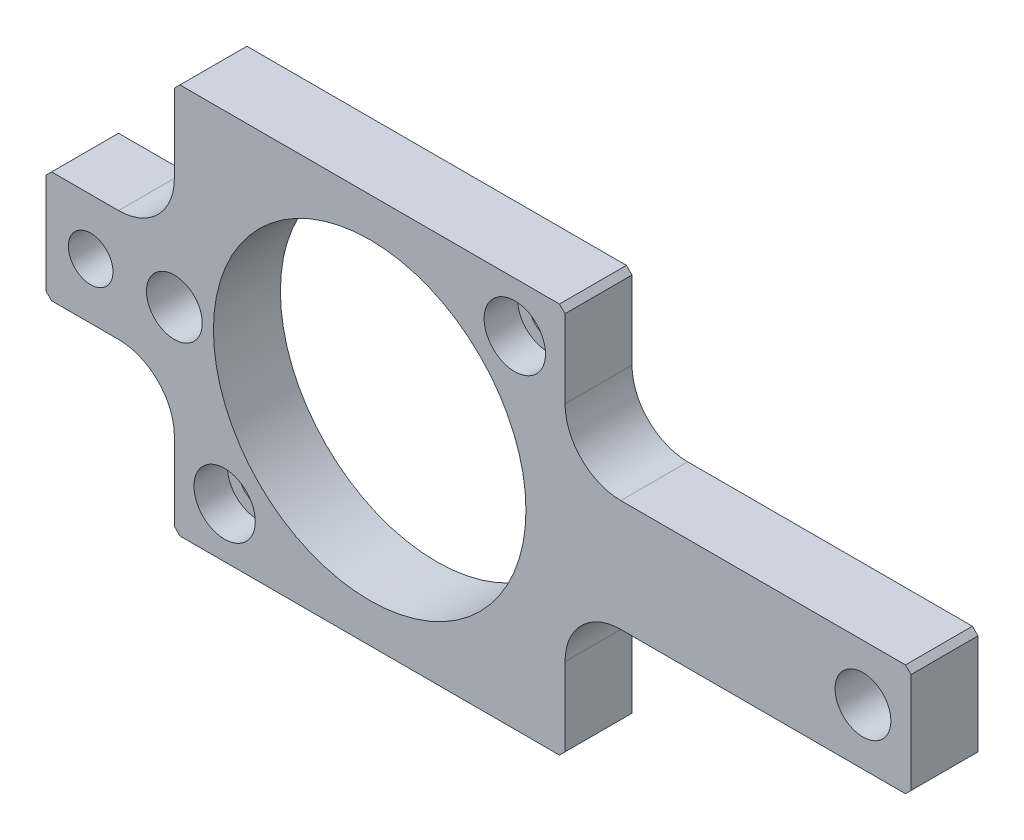
ISO-10303-21;
HEADER;
FILE_DESCRIPTION(('STEP AP214'),'2;1');
FILE_NAME('part.step','',(''),(''),'','','');
FILE_SCHEMA(('AUTOMOTIVE_DESIGN { 1 0 10303 214 1 1 1 1 }'));
ENDSEC;
DATA;
#1=APPLICATION_CONTEXT('core data for automotive mechanical design processes');
#2=APPLICATION_PROTOCOL_DEFINITION('international standard','automotive_design',2000,#1);
#3=PRODUCT_CONTEXT('',#1,'mechanical');
#4=PRODUCT('Part','Part','',(#3));
#5=PRODUCT_RELATED_PRODUCT_CATEGORY('part','',(#4));
#6=PRODUCT_DEFINITION_FORMATION('','',#4);
#7=PRODUCT_DEFINITION_CONTEXT('part definition',#1,'design');
#8=PRODUCT_DEFINITION('design','',#6,#7);
#9=PRODUCT_DEFINITION_SHAPE('','',#8);
#10=(LENGTH_UNIT() NAMED_UNIT(*) SI_UNIT(.MILLI.,.METRE.));
#11=(NAMED_UNIT(*) PLANE_ANGLE_UNIT() SI_UNIT($,.RADIAN.));
#12=(NAMED_UNIT(*) SI_UNIT($,.STERADIAN.) SOLID_ANGLE_UNIT());
#13=UNCERTAINTY_MEASURE_WITH_UNIT(LENGTH_MEASURE(1.E-05),#10,'distance_accuracy_value','');
#14=(GEOMETRIC_REPRESENTATION_CONTEXT(3) GLOBAL_UNCERTAINTY_ASSIGNED_CONTEXT((#13)) GLOBAL_UNIT_ASSIGNED_CONTEXT((#10,
#11,#12)) REPRESENTATION_CONTEXT('',''));
#15=CARTESIAN_POINT('',(0.,0.,0.));
#16=DIRECTION('',(0.,0.,1.));
#17=DIRECTION('',(1.,0.,0.));
#18=AXIS2_PLACEMENT_3D('',#15,#16,#17);
#19=CARTESIAN_POINT('',(80.,15.,12.));
#20=DIRECTION('',(0.,0.,-1.));
#21=DIRECTION('',(-1.,0.,0.));
#22=AXIS2_PLACEMENT_3D('',#19,#20,#21);
#23=PLANE('',#22);
#24=CARTESIAN_POINT('',(123.39,35.,12.));
#25=DIRECTION('',(0.,0.,1.));
#26=DIRECTION('',(1.,0.,0.));
#27=AXIS2_PLACEMENT_3D('',#24,#25,#26);
#28=CIRCLE('',#27,4.99999999999999);
#29=CARTESIAN_POINT('',(128.39,35.,12.));
#30=VERTEX_POINT('',#29);
#31=EDGE_CURVE('E515',#30,#30,#28,.T.);
#32=ORIENTED_EDGE('',*,*,#31,.F.);
#33=EDGE_LOOP('',(#32));
#34=FACE_BOUND('',#33,.T.);
#35=CARTESIAN_POINT('',(-15.,35.,12.));
#36=DIRECTION('',(0.,0.,1.));
#37=DIRECTION('',(1.,0.,0.));
#38=AXIS2_PLACEMENT_3D('',#35,#36,#37);
#39=CIRCLE('',#38,4.);
#40=CARTESIAN_POINT('',(-11.,35.,12.));
#41=VERTEX_POINT('',#40);
#42=EDGE_CURVE('E509',#41,#41,#39,.T.);
#43=ORIENTED_EDGE('',*,*,#42,.F.);
#44=EDGE_LOOP('',(#43));
#45=FACE_BOUND('',#44,.T.);
#46=CARTESIAN_POINT('',(0.,35.,12.));
#47=DIRECTION('',(0.,0.,1.));
#48=DIRECTION('',(1.,0.,0.));
#49=AXIS2_PLACEMENT_3D('',#46,#47,#48);
#50=CIRCLE('',#49,5.);
#51=CARTESIAN_POINT('',(5.,35.,12.));
#52=VERTEX_POINT('',#51);
#53=EDGE_CURVE('E503',#52,#52,#50,.T.);
#54=ORIENTED_EDGE('',*,*,#53,.F.);
#55=EDGE_LOOP('',(#54));
#56=FACE_BOUND('',#55,.T.);
#57=CARTESIAN_POINT('',(9.00000000000001,9.00000000000001,12.));
#58=DIRECTION('',(0.,0.,1.));
#59=DIRECTION('',(1.,0.,0.));
#60=AXIS2_PLACEMENT_3D('',#57,#58,#59);
#61=CIRCLE('',#60,5.5);
#62=CARTESIAN_POINT('',(14.5,9.00000000000001,12.));
#63=VERTEX_POINT('',#62);
#64=EDGE_CURVE('E497',#63,#63,#61,.T.);
#65=ORIENTED_EDGE('',*,*,#64,.F.);
#66=EDGE_LOOP('',(#65));
#67=FACE_BOUND('',#66,.T.);
#68=CARTESIAN_POINT('',(61.,61.,12.));
#69=DIRECTION('',(0.,0.,1.));
#70=DIRECTION('',(1.,0.,0.));
#71=AXIS2_PLACEMENT_3D('',#68,#69,#70);
#72=CIRCLE('',#71,5.5);
#73=CARTESIAN_POINT('',(66.5,61.,12.));
#74=VERTEX_POINT('',#73);
#75=EDGE_CURVE('E485',#74,#74,#72,.T.);
#76=ORIENTED_EDGE('',*,*,#75,.F.);
#77=EDGE_LOOP('',(#76));
#78=FACE_BOUND('',#77,.T.);
#79=DIRECTION('',(0.,-1.,0.));
#80=VECTOR('',#79,1.);
#81=CARTESIAN_POINT('',(0.,14.9999999999999,12.));
#82=LINE('',#81,#80);
#83=CARTESIAN_POINT('',(0.,14.9999999999999,12.));
#84=VERTEX_POINT('',#83);
#85=CARTESIAN_POINT('',(0.,1.00000000000002,12.));
#86=VERTEX_POINT('',#85);
#87=EDGE_CURVE('E252',#84,#86,#82,.T.);
#88=ORIENTED_EDGE('',*,*,#87,.T.);
#89=DIRECTION('',(-0.707106781186544,0.707106781186552,0.));
#90=VECTOR('',#89,1.);
#91=CARTESIAN_POINT('',(1.00000000000001,0.,12.));
#92=LINE('',#91,#90);
#93=CARTESIAN_POINT('',(1.00000000000001,0.,12.));
#94=VERTEX_POINT('',#93);
#95=EDGE_CURVE('E344',#86,#94,#92,.F.);
#96=ORIENTED_EDGE('',*,*,#95,.T.);
#97=DIRECTION('',(1.,0.,0.));
#98=VECTOR('',#97,1.);
#99=CARTESIAN_POINT('',(0.,0.,12.));
#100=LINE('',#99,#98);
#101=CARTESIAN_POINT('',(69.,0.,12.));
#102=VERTEX_POINT('',#101);
#103=EDGE_CURVE('E255',#94,#102,#100,.T.);
#104=ORIENTED_EDGE('',*,*,#103,.T.);
#105=DIRECTION('',(-0.707106781186542,-0.707106781186553,0.));
#106=VECTOR('',#105,1.);
#107=CARTESIAN_POINT('',(70.,1.00000000000002,12.));
#108=LINE('',#107,#106);
#109=CARTESIAN_POINT('',(70.,1.00000000000002,12.));
#110=VERTEX_POINT('',#109);
#111=EDGE_CURVE('E331',#102,#110,#108,.F.);
#112=ORIENTED_EDGE('',*,*,#111,.T.);
#113=DIRECTION('',(0.,1.,0.));
#114=VECTOR('',#113,1.);
#115=CARTESIAN_POINT('',(70.,0.,12.));
#116=LINE('',#115,#114);
#117=CARTESIAN_POINT('',(70.,14.9999999999999,12.));
#118=VERTEX_POINT('',#117);
#119=EDGE_CURVE('E258',#110,#118,#116,.T.);
#120=ORIENTED_EDGE('',*,*,#119,.T.);
#121=CARTESIAN_POINT('',(80.,15.,12.));
#122=DIRECTION('',(0.,0.,-1.));
#123=DIRECTION('',(-1.,0.,0.));
#124=AXIS2_PLACEMENT_3D('',#121,#122,#123);
#125=CIRCLE('',#124,10.);
#126=CARTESIAN_POINT('',(80.0000000000001,25.,12.));
#127=VERTEX_POINT('',#126);
#128=EDGE_CURVE('E212',#118,#127,#125,.T.);
#129=ORIENTED_EDGE('',*,*,#128,.T.);
#130=DIRECTION('',(1.,0.,0.));
#131=VECTOR('',#130,1.);
#132=CARTESIAN_POINT('',(80.0000000000001,25.,12.));
#133=LINE('',#132,#131);
#134=CARTESIAN_POINT('',(131.,25.,12.));
#135=VERTEX_POINT('',#134);
#136=EDGE_CURVE('E261',#127,#135,#133,.T.);
#137=ORIENTED_EDGE('',*,*,#136,.T.);
#138=DIRECTION('',(-0.707106781186541,-0.707106781186554,0.));
#139=VECTOR('',#138,1.);
#140=CARTESIAN_POINT('',(132.,26.,12.));
#141=LINE('',#140,#139);
#142=CARTESIAN_POINT('',(132.,26.,12.));
#143=VERTEX_POINT('',#142);
#144=EDGE_CURVE('E333',#135,#143,#141,.F.);
#145=ORIENTED_EDGE('',*,*,#144,.T.);
#146=DIRECTION('',(0.,1.,0.));
#147=VECTOR('',#146,1.);
#148=CARTESIAN_POINT('',(132.,25.,12.));
#149=LINE('',#148,#147);
#150=CARTESIAN_POINT('',(132.,44.,12.));
#151=VERTEX_POINT('',#150);
#152=EDGE_CURVE('E264',#143,#151,#149,.T.);
#153=ORIENTED_EDGE('',*,*,#152,.T.);
#154=DIRECTION('',(0.707106781186555,-0.70710678118654,0.));
#155=VECTOR('',#154,1.);
#156=CARTESIAN_POINT('',(131.,45.,12.));
#157=LINE('',#156,#155);
#158=CARTESIAN_POINT('',(131.,45.,12.));
#159=VERTEX_POINT('',#158);
#160=EDGE_CURVE('E335',#151,#159,#157,.F.);
#161=ORIENTED_EDGE('',*,*,#160,.T.);
#162=DIRECTION('',(-1.,0.,0.));
#163=VECTOR('',#162,1.);
#164=CARTESIAN_POINT('',(132.,45.,12.));
#165=LINE('',#164,#163);
#166=CARTESIAN_POINT('',(80.0000000000001,45.,12.));
#167=VERTEX_POINT('',#166);
#168=EDGE_CURVE('E267',#159,#167,#165,.T.);
#169=ORIENTED_EDGE('',*,*,#168,.T.);
#170=CARTESIAN_POINT('',(80.,55.,12.));
#171=DIRECTION('',(0.,0.,-1.));
#172=DIRECTION('',(1.,0.,0.));
#173=AXIS2_PLACEMENT_3D('',#170,#171,#172);
#174=CIRCLE('',#173,10.);
#175=CARTESIAN_POINT('',(70.,55.0000000000001,12.));
#176=VERTEX_POINT('',#175);
#177=EDGE_CURVE('E269',#167,#176,#174,.T.);
#178=ORIENTED_EDGE('',*,*,#177,.T.);
#179=DIRECTION('',(0.,1.,0.));
#180=VECTOR('',#179,1.);
#181=CARTESIAN_POINT('',(70.,55.0000000000001,12.));
#182=LINE('',#181,#180);
#183=CARTESIAN_POINT('',(70.,69.,12.));
#184=VERTEX_POINT('',#183);
#185=EDGE_CURVE('E271',#176,#184,#182,.T.);
#186=ORIENTED_EDGE('',*,*,#185,.T.);
#187=DIRECTION('',(0.707106781186552,-0.707106781186543,0.));
#188=VECTOR('',#187,1.);
#189=CARTESIAN_POINT('',(69.,70.,12.));
#190=LINE('',#189,#188);
#191=CARTESIAN_POINT('',(69.,70.,12.));
#192=VERTEX_POINT('',#191);
#193=EDGE_CURVE('E337',#184,#192,#190,.F.);
#194=ORIENTED_EDGE('',*,*,#193,.T.);
#195=DIRECTION('',(-1.,0.,0.));
#196=VECTOR('',#195,1.);
#197=CARTESIAN_POINT('',(70.,70.,12.));
#198=LINE('',#197,#196);
#199=CARTESIAN_POINT('',(1.,70.,12.));
#200=VERTEX_POINT('',#199);
#201=EDGE_CURVE('E274',#192,#200,#198,.T.);
#202=ORIENTED_EDGE('',*,*,#201,.T.);
#203=DIRECTION('',(0.707106781186546,0.707106781186549,0.));
#204=VECTOR('',#203,1.);
#205=CARTESIAN_POINT('',(0.,69.,12.));
#206=LINE('',#205,#204);
#207=CARTESIAN_POINT('',(0.,69.,12.));
#208=VERTEX_POINT('',#207);
#209=EDGE_CURVE('E339',#200,#208,#206,.F.);
#210=ORIENTED_EDGE('',*,*,#209,.T.);
#211=DIRECTION('',(0.,-1.,0.));
#212=VECTOR('',#211,1.);
#213=CARTESIAN_POINT('',(0.,70.,12.));
#214=LINE('',#213,#212);
#215=CARTESIAN_POINT('',(0.,55.0000000000001,12.));
#216=VERTEX_POINT('',#215);
#217=EDGE_CURVE('E277',#208,#216,#214,.T.);
#218=ORIENTED_EDGE('',*,*,#217,.T.);
#219=CARTESIAN_POINT('',(-10.,55.,12.));
#220=DIRECTION('',(0.,0.,-1.));
#221=DIRECTION('',(-1.,0.,0.));
#222=AXIS2_PLACEMENT_3D('',#219,#220,#221);
#223=CIRCLE('',#222,10.);
#224=CARTESIAN_POINT('',(-10.0000000000001,45.,12.));
#225=VERTEX_POINT('',#224);
#226=EDGE_CURVE('E279',#216,#225,#223,.T.);
#227=ORIENTED_EDGE('',*,*,#226,.T.);
#228=DIRECTION('',(-1.,0.,0.));
#229=VECTOR('',#228,1.);
#230=CARTESIAN_POINT('',(-10.0000000000001,45.,12.));
#231=LINE('',#230,#229);
#232=CARTESIAN_POINT('',(-22.,45.,12.));
#233=VERTEX_POINT('',#232);
#234=EDGE_CURVE('E281',#225,#233,#231,.T.);
#235=ORIENTED_EDGE('',*,*,#234,.T.);
#236=DIRECTION('',(0.707106781186545,0.70710678118655,0.));
#237=VECTOR('',#236,1.);
#238=CARTESIAN_POINT('',(-23.,44.,12.));
#239=LINE('',#238,#237);
#240=CARTESIAN_POINT('',(-23.,44.,12.));
#241=VERTEX_POINT('',#240);
#242=EDGE_CURVE('E341',#233,#241,#239,.F.);
#243=ORIENTED_EDGE('',*,*,#242,.T.);
#244=DIRECTION('',(0.,-1.,0.));
#245=VECTOR('',#244,1.);
#246=CARTESIAN_POINT('',(-23.,45.,12.));
#247=LINE('',#246,#245);
#248=CARTESIAN_POINT('',(-23.,26.,12.));
#249=VERTEX_POINT('',#248);
#250=EDGE_CURVE('E284',#241,#249,#247,.T.);
#251=ORIENTED_EDGE('',*,*,#250,.T.);
#252=DIRECTION('',(-0.707106781186551,0.707106781186544,0.));
#253=VECTOR('',#252,1.);
#254=CARTESIAN_POINT('',(-22.,25.,12.));
#255=LINE('',#254,#253);
#256=CARTESIAN_POINT('',(-22.,25.,12.));
#257=VERTEX_POINT('',#256);
#258=EDGE_CURVE('E48',#249,#257,#255,.F.);
#259=ORIENTED_EDGE('',*,*,#258,.T.);
#260=DIRECTION('',(1.,0.,0.));
#261=VECTOR('',#260,1.);
#262=CARTESIAN_POINT('',(-23.,25.,12.));
#263=LINE('',#262,#261);
#264=CARTESIAN_POINT('',(-10.0000000000001,25.,12.));
#265=VERTEX_POINT('',#264);
#266=EDGE_CURVE('E286',#257,#265,#263,.T.);
#267=ORIENTED_EDGE('',*,*,#266,.T.);
#268=CARTESIAN_POINT('',(-10.,15.,12.));
#269=DIRECTION('',(0.,0.,-1.));
#270=DIRECTION('',(1.,0.,0.));
#271=AXIS2_PLACEMENT_3D('',#268,#269,#270);
#272=CIRCLE('',#271,10.);
#273=EDGE_CURVE('E288',#265,#84,#272,.T.);
#274=ORIENTED_EDGE('',*,*,#273,.T.);
#275=EDGE_LOOP('',(#88,#96,#104,#112,#120,#129,#137,#145,#153,#161,#169,#178,#186,#194,#202,
#210,#218,#227,#235,#243,#251,#259,#267,#274));
#276=FACE_BOUND('',#275,.T.);
#277=CARTESIAN_POINT('',(35.,35.,12.));
#278=DIRECTION('',(0.,0.,1.));
#279=DIRECTION('',(1.,0.,0.));
#280=AXIS2_PLACEMENT_3D('',#277,#278,#279);
#281=CIRCLE('',#280,28.);
#282=CARTESIAN_POINT('',(63.,35.,12.));
#283=VERTEX_POINT('',#282);
#284=EDGE_CURVE('E468',#283,#283,#281,.T.);
#285=ORIENTED_EDGE('',*,*,#284,.F.);
#286=EDGE_LOOP('',(#285));
#287=FACE_BOUND('',#286,.T.);
#288=ADVANCED_FACE('F33',(#34,#45,#56,#67,#78,#276,#287),#23,.F.);
#289=CARTESIAN_POINT('',(80.,15.,0.));
#290=DIRECTION('',(0.,0.,-1.));
#291=DIRECTION('',(-1.,0.,0.));
#292=AXIS2_PLACEMENT_3D('',#289,#290,#291);
#293=PLANE('',#292);
#294=CARTESIAN_POINT('',(123.39,35.,-4.49293380277993E-13));
#295=DIRECTION('',(0.,0.,1.));
#296=DIRECTION('',(1.,0.,0.));
#297=AXIS2_PLACEMENT_3D('',#294,#295,#296);
#298=CIRCLE('',#297,4.99999999999999);
#299=CARTESIAN_POINT('',(128.39,35.,-4.49293380277993E-13));
#300=VERTEX_POINT('',#299);
#301=EDGE_CURVE('E512',#300,#300,#298,.T.);
#302=ORIENTED_EDGE('',*,*,#301,.T.);
#303=EDGE_LOOP('',(#302));
#304=FACE_BOUND('',#303,.T.);
#305=CARTESIAN_POINT('',(-15.,35.,-4.49293380277993E-13));
#306=DIRECTION('',(0.,0.,1.));
#307=DIRECTION('',(1.,0.,0.));
#308=AXIS2_PLACEMENT_3D('',#305,#306,#307);
#309=CIRCLE('',#308,4.);
#310=CARTESIAN_POINT('',(-11.,35.,-4.49293380277993E-13));
#311=VERTEX_POINT('',#310);
#312=EDGE_CURVE('E506',#311,#311,#309,.T.);
#313=ORIENTED_EDGE('',*,*,#312,.T.);
#314=EDGE_LOOP('',(#313));
#315=FACE_BOUND('',#314,.T.);
#316=CARTESIAN_POINT('',(0.,35.,-4.49293380277993E-13));
#317=DIRECTION('',(0.,0.,1.));
#318=DIRECTION('',(1.,0.,0.));
#319=AXIS2_PLACEMENT_3D('',#316,#317,#318);
#320=CIRCLE('',#319,5.);
#321=CARTESIAN_POINT('',(5.,35.,-4.49293380277993E-13));
#322=VERTEX_POINT('',#321);
#323=EDGE_CURVE('E500',#322,#322,#320,.T.);
#324=ORIENTED_EDGE('',*,*,#323,.T.);
#325=EDGE_LOOP('',(#324));
#326=FACE_BOUND('',#325,.T.);
#327=CARTESIAN_POINT('',(9.00000000000001,9.00000000000001,-4.49293380277993E-13));
#328=DIRECTION('',(0.,0.,1.));
#329=DIRECTION('',(1.,0.,0.));
#330=AXIS2_PLACEMENT_3D('',#327,#328,#329);
#331=CIRCLE('',#330,3.3);
#332=CARTESIAN_POINT('',(12.3,9.00000000000001,-4.49293380277993E-13));
#333=VERTEX_POINT('',#332);
#334=EDGE_CURVE('E488',#333,#333,#331,.T.);
#335=ORIENTED_EDGE('',*,*,#334,.T.);
#336=EDGE_LOOP('',(#335));
#337=FACE_BOUND('',#336,.T.);
#338=CARTESIAN_POINT('',(61.,61.,-4.49293380277993E-13));
#339=DIRECTION('',(0.,0.,1.));
#340=DIRECTION('',(1.,0.,0.));
#341=AXIS2_PLACEMENT_3D('',#338,#339,#340);
#342=CIRCLE('',#341,3.3);
#343=CARTESIAN_POINT('',(64.3,61.,-4.49293380277993E-13));
#344=VERTEX_POINT('',#343);
#345=EDGE_CURVE('E476',#344,#344,#342,.T.);
#346=ORIENTED_EDGE('',*,*,#345,.T.);
#347=EDGE_LOOP('',(#346));
#348=FACE_BOUND('',#347,.T.);
#349=DIRECTION('',(1.,0.,0.));
#350=VECTOR('',#349,1.);
#351=CARTESIAN_POINT('',(0.,0.,0.));
#352=LINE('',#351,#350);
#353=CARTESIAN_POINT('',(0.999999999999988,0.,0.));
#354=VERTEX_POINT('',#353);
#355=CARTESIAN_POINT('',(69.,0.,0.));
#356=VERTEX_POINT('',#355);
#357=EDGE_CURVE('E206',#354,#356,#352,.T.);
#358=ORIENTED_EDGE('',*,*,#357,.F.);
#359=DIRECTION('',(0.707106781186544,-0.707106781186552,0.));
#360=VECTOR('',#359,1.);
#361=CARTESIAN_POINT('',(32.9999999999996,-31.9999999999999,0.));
#362=LINE('',#361,#360);
#363=CARTESIAN_POINT('',(0.,1.00000000000002,0.));
#364=VERTEX_POINT('',#363);
#365=EDGE_CURVE('E327',#354,#364,#362,.F.);
#366=ORIENTED_EDGE('',*,*,#365,.T.);
#367=DIRECTION('',(0.,-1.,0.));
#368=VECTOR('',#367,1.);
#369=CARTESIAN_POINT('',(0.,14.9999999999999,0.));
#370=LINE('',#369,#368);
#371=CARTESIAN_POINT('',(0.,14.9999999999999,0.));
#372=VERTEX_POINT('',#371);
#373=EDGE_CURVE('E456',#372,#364,#370,.T.);
#374=ORIENTED_EDGE('',*,*,#373,.F.);
#375=CARTESIAN_POINT('',(-10.,15.,0.));
#376=DIRECTION('',(0.,0.,-1.));
#377=DIRECTION('',(1.,0.,0.));
#378=AXIS2_PLACEMENT_3D('',#375,#376,#377);
#379=CIRCLE('',#378,10.);
#380=CARTESIAN_POINT('',(-10.0000000000001,25.,0.));
#381=VERTEX_POINT('',#380);
#382=EDGE_CURVE('E250',#381,#372,#379,.T.);
#383=ORIENTED_EDGE('',*,*,#382,.F.);
#384=DIRECTION('',(1.,0.,0.));
#385=VECTOR('',#384,1.);
#386=CARTESIAN_POINT('',(-23.,25.,0.));
#387=LINE('',#386,#385);
#388=CARTESIAN_POINT('',(-22.,25.,0.));
#389=VERTEX_POINT('',#388);
#390=EDGE_CURVE('E248',#389,#381,#387,.T.);
#391=ORIENTED_EDGE('',*,*,#390,.F.);
#392=DIRECTION('',(0.707106781186551,-0.707106781186544,0.));
#393=VECTOR('',#392,1.);
#394=CARTESIAN_POINT('',(34.0000000000005,-30.9999999999999,0.));
#395=LINE('',#394,#393);
#396=CARTESIAN_POINT('',(-23.,26.,0.));
#397=VERTEX_POINT('',#396);
#398=EDGE_CURVE('E325',#389,#397,#395,.F.);
#399=ORIENTED_EDGE('',*,*,#398,.T.);
#400=DIRECTION('',(0.,-1.,0.));
#401=VECTOR('',#400,1.);
#402=CARTESIAN_POINT('',(-23.,45.,0.));
#403=LINE('',#402,#401);
#404=CARTESIAN_POINT('',(-23.,44.,0.));
#405=VERTEX_POINT('',#404);
#406=EDGE_CURVE('E246',#405,#397,#403,.T.);
#407=ORIENTED_EDGE('',*,*,#406,.F.);
#408=DIRECTION('',(-0.707106781186545,-0.70710678118655,0.));
#409=VECTOR('',#408,1.);
#410=CARTESIAN_POINT('',(13.9999999999997,80.9999999999999,0.));
#411=LINE('',#410,#409);
#412=CARTESIAN_POINT('',(-22.,45.,0.));
#413=VERTEX_POINT('',#412);
#414=EDGE_CURVE('E323',#405,#413,#411,.F.);
#415=ORIENTED_EDGE('',*,*,#414,.T.);
#416=DIRECTION('',(-1.,0.,0.));
#417=VECTOR('',#416,1.);
#418=CARTESIAN_POINT('',(-10.0000000000001,45.,0.));
#419=LINE('',#418,#417);
#420=CARTESIAN_POINT('',(-10.0000000000001,45.,0.));
#421=VERTEX_POINT('',#420);
#422=EDGE_CURVE('E243',#421,#413,#419,.T.);
#423=ORIENTED_EDGE('',*,*,#422,.F.);
#424=CARTESIAN_POINT('',(-10.,55.,0.));
#425=DIRECTION('',(0.,0.,-1.));
#426=DIRECTION('',(-1.,0.,0.));
#427=AXIS2_PLACEMENT_3D('',#424,#425,#426);
#428=CIRCLE('',#427,10.);
#429=CARTESIAN_POINT('',(0.,55.0000000000001,0.));
#430=VERTEX_POINT('',#429);
#431=EDGE_CURVE('E241',#430,#421,#428,.T.);
#432=ORIENTED_EDGE('',*,*,#431,.F.);
#433=DIRECTION('',(0.,-1.,0.));
#434=VECTOR('',#433,1.);
#435=CARTESIAN_POINT('',(0.,70.,0.));
#436=LINE('',#435,#434);
#437=CARTESIAN_POINT('',(0.,69.,0.));
#438=VERTEX_POINT('',#437);
#439=EDGE_CURVE('E239',#438,#430,#436,.T.);
#440=ORIENTED_EDGE('',*,*,#439,.F.);
#441=DIRECTION('',(-0.707106781186546,-0.707106781186549,0.));
#442=VECTOR('',#441,1.);
#443=CARTESIAN_POINT('',(12.9999999999999,81.9999999999999,0.));
#444=LINE('',#443,#442);
#445=CARTESIAN_POINT('',(1.,70.,0.));
#446=VERTEX_POINT('',#445);
#447=EDGE_CURVE('E321',#438,#446,#444,.F.);
#448=ORIENTED_EDGE('',*,*,#447,.T.);
#449=DIRECTION('',(-1.,0.,0.));
#450=VECTOR('',#449,1.);
#451=CARTESIAN_POINT('',(70.,70.,0.));
#452=LINE('',#451,#450);
#453=CARTESIAN_POINT('',(69.,70.,0.));
#454=VERTEX_POINT('',#453);
#455=EDGE_CURVE('E236',#454,#446,#452,.T.);
#456=ORIENTED_EDGE('',*,*,#455,.F.);
#457=DIRECTION('',(-0.707106781186552,0.707106781186543,0.));
#458=VECTOR('',#457,1.);
#459=CARTESIAN_POINT('',(102.,37.0000000000004,0.));
#460=LINE('',#459,#458);
#461=CARTESIAN_POINT('',(70.,69.,0.));
#462=VERTEX_POINT('',#461);
#463=EDGE_CURVE('E319',#454,#462,#460,.F.);
#464=ORIENTED_EDGE('',*,*,#463,.T.);
#465=DIRECTION('',(0.,1.,0.));
#466=VECTOR('',#465,1.);
#467=CARTESIAN_POINT('',(70.,55.0000000000001,0.));
#468=LINE('',#467,#466);
#469=CARTESIAN_POINT('',(70.,55.0000000000001,0.));
#470=VERTEX_POINT('',#469);
#471=EDGE_CURVE('E233',#470,#462,#468,.T.);
#472=ORIENTED_EDGE('',*,*,#471,.F.);
#473=CARTESIAN_POINT('',(80.,55.,0.));
#474=DIRECTION('',(0.,0.,-1.));
#475=DIRECTION('',(1.,0.,0.));
#476=AXIS2_PLACEMENT_3D('',#473,#474,#475);
#477=CIRCLE('',#476,10.);
#478=CARTESIAN_POINT('',(80.0000000000001,45.,0.));
#479=VERTEX_POINT('',#478);
#480=EDGE_CURVE('E231',#479,#470,#477,.T.);
#481=ORIENTED_EDGE('',*,*,#480,.F.);
#482=DIRECTION('',(-1.,0.,0.));
#483=VECTOR('',#482,1.);
#484=CARTESIAN_POINT('',(132.,45.,0.));
#485=LINE('',#484,#483);
#486=CARTESIAN_POINT('',(131.,45.,0.));
#487=VERTEX_POINT('',#486);
#488=EDGE_CURVE('E229',#487,#479,#485,.T.);
#489=ORIENTED_EDGE('',*,*,#488,.F.);
#490=DIRECTION('',(-0.707106781186555,0.70710678118654,0.));
#491=VECTOR('',#490,1.);
#492=CARTESIAN_POINT('',(120.499999999999,55.5000000000003,0.));
#493=LINE('',#492,#491);
#494=CARTESIAN_POINT('',(132.,44.,0.));
#495=VERTEX_POINT('',#494);
#496=EDGE_CURVE('E317',#487,#495,#493,.F.);
#497=ORIENTED_EDGE('',*,*,#496,.T.);
#498=DIRECTION('',(0.,1.,0.));
#499=VECTOR('',#498,1.);
#500=CARTESIAN_POINT('',(132.,25.,0.));
#501=LINE('',#500,#499);
#502=CARTESIAN_POINT('',(132.,26.,0.));
#503=VERTEX_POINT('',#502);
#504=EDGE_CURVE('E223',#503,#495,#501,.T.);
#505=ORIENTED_EDGE('',*,*,#504,.F.);
#506=DIRECTION('',(0.707106781186541,0.707106781186554,0.));
#507=VECTOR('',#506,1.);
#508=CARTESIAN_POINT('',(100.5,-5.50000000000008,0.));
#509=LINE('',#508,#507);
#510=CARTESIAN_POINT('',(131.,25.,0.));
#511=VERTEX_POINT('',#510);
#512=EDGE_CURVE('E315',#503,#511,#509,.F.);
#513=ORIENTED_EDGE('',*,*,#512,.T.);
#514=DIRECTION('',(1.,0.,0.));
#515=VECTOR('',#514,1.);
#516=CARTESIAN_POINT('',(80.0000000000001,25.,0.));
#517=LINE('',#516,#515);
#518=CARTESIAN_POINT('',(80.0000000000001,25.,0.));
#519=VERTEX_POINT('',#518);
#520=EDGE_CURVE('E221',#519,#511,#517,.T.);
#521=ORIENTED_EDGE('',*,*,#520,.F.);
#522=CARTESIAN_POINT('',(80.,15.,0.));
#523=DIRECTION('',(0.,0.,-1.));
#524=DIRECTION('',(-1.,0.,0.));
#525=AXIS2_PLACEMENT_3D('',#522,#523,#524);
#526=CIRCLE('',#525,10.);
#527=CARTESIAN_POINT('',(70.,14.9999999999999,0.));
#528=VERTEX_POINT('',#527);
#529=EDGE_CURVE('E205',#528,#519,#526,.T.);
#530=ORIENTED_EDGE('',*,*,#529,.F.);
#531=DIRECTION('',(0.,1.,0.));
#532=VECTOR('',#531,1.);
#533=CARTESIAN_POINT('',(70.,0.,0.));
#534=LINE('',#533,#532);
#535=CARTESIAN_POINT('',(70.,1.00000000000001,0.));
#536=VERTEX_POINT('',#535);
#537=EDGE_CURVE('E196',#536,#528,#534,.T.);
#538=ORIENTED_EDGE('',*,*,#537,.F.);
#539=DIRECTION('',(0.707106781186542,0.707106781186553,0.));
#540=VECTOR('',#539,1.);
#541=CARTESIAN_POINT('',(81.9999999999999,13.0000000000001,0.));
#542=LINE('',#541,#540);
#543=EDGE_CURVE('E313',#536,#356,#542,.F.);
#544=ORIENTED_EDGE('',*,*,#543,.T.);
#545=EDGE_LOOP('',(#358,#366,#374,#383,#391,#399,#407,#415,#423,#432,#440,#448,#456,#464,#472,
#481,#489,#497,#505,#513,#521,#530,#538,#544));
#546=FACE_BOUND('',#545,.T.);
#547=CARTESIAN_POINT('',(35.,35.,0.));
#548=DIRECTION('',(0.,0.,1.));
#549=DIRECTION('',(1.,0.,0.));
#550=AXIS2_PLACEMENT_3D('',#547,#548,#549);
#551=CIRCLE('',#550,28.);
#552=CARTESIAN_POINT('',(63.,35.,0.));
#553=VERTEX_POINT('',#552);
#554=EDGE_CURVE('E473',#553,#553,#551,.T.);
#555=ORIENTED_EDGE('',*,*,#554,.T.);
#556=EDGE_LOOP('',(#555));
#557=FACE_BOUND('',#556,.T.);
#558=ADVANCED_FACE('F218',(#304,#315,#326,#337,#348,#546,#557),#293,.T.);
#559=CARTESIAN_POINT('',(0.,14.9999999999999,12.));
#560=DIRECTION('',(1.,0.,0.));
#561=DIRECTION('',(0.,1.,0.));
#562=AXIS2_PLACEMENT_3D('',#559,#560,#561);
#563=PLANE('',#562);
#564=ORIENTED_EDGE('',*,*,#373,.T.);
#565=DIRECTION('',(0.,0.,1.));
#566=VECTOR('',#565,1.);
#567=CARTESIAN_POINT('',(0.,1.00000000000002,12.));
#568=LINE('',#567,#566);
#569=EDGE_CURVE('E329',#364,#86,#568,.T.);
#570=ORIENTED_EDGE('',*,*,#569,.T.);
#571=ORIENTED_EDGE('',*,*,#87,.F.);
#572=DIRECTION('',(0.,0.,-1.));
#573=VECTOR('',#572,1.);
#574=CARTESIAN_POINT('',(0.,14.9999999999999,12.));
#575=LINE('',#574,#573);
#576=EDGE_CURVE('E290',#84,#372,#575,.T.);
#577=ORIENTED_EDGE('',*,*,#576,.T.);
#578=EDGE_LOOP('',(#564,#570,#571,#577));
#579=FACE_BOUND('',#578,.T.);
#580=ADVANCED_FACE('F35',(#579),#563,.F.);
#581=CARTESIAN_POINT('',(0.,0.,12.));
#582=DIRECTION('',(0.,1.,0.));
#583=DIRECTION('',(0.,0.,1.));
#584=AXIS2_PLACEMENT_3D('',#581,#582,#583);
#585=PLANE('',#584);
#586=ORIENTED_EDGE('',*,*,#103,.F.);
#587=DIRECTION('',(0.,0.,-1.));
#588=VECTOR('',#587,1.);
#589=CARTESIAN_POINT('',(1.00000000000001,0.,12.));
#590=LINE('',#589,#588);
#591=EDGE_CURVE('E310',#94,#354,#590,.T.);
#592=ORIENTED_EDGE('',*,*,#591,.T.);
#593=ORIENTED_EDGE('',*,*,#357,.T.);
#594=DIRECTION('',(0.,0.,1.));
#595=VECTOR('',#594,1.);
#596=CARTESIAN_POINT('',(69.,0.,12.));
#597=LINE('',#596,#595);
#598=EDGE_CURVE('E213',#356,#102,#597,.T.);
#599=ORIENTED_EDGE('',*,*,#598,.T.);
#600=EDGE_LOOP('',(#586,#592,#593,#599));
#601=FACE_BOUND('',#600,.T.);
#602=ADVANCED_FACE('F463',(#601),#585,.F.);
#603=CARTESIAN_POINT('',(70.,0.,12.));
#604=DIRECTION('',(-1.,0.,0.));
#605=DIRECTION('',(0.,0.,1.));
#606=AXIS2_PLACEMENT_3D('',#603,#604,#605);
#607=PLANE('',#606);
#608=ORIENTED_EDGE('',*,*,#119,.F.);
#609=DIRECTION('',(0.,0.,-1.));
#610=VECTOR('',#609,1.);
#611=CARTESIAN_POINT('',(70.,1.00000000000002,12.));
#612=LINE('',#611,#610);
#613=EDGE_CURVE('E11',#110,#536,#612,.T.);
#614=ORIENTED_EDGE('',*,*,#613,.T.);
#615=ORIENTED_EDGE('',*,*,#537,.T.);
#616=DIRECTION('',(0.,0.,-1.));
#617=VECTOR('',#616,1.);
#618=CARTESIAN_POINT('',(70.,14.9999999999999,12.));
#619=LINE('',#618,#617);
#620=EDGE_CURVE('E200',#118,#528,#619,.T.);
#621=ORIENTED_EDGE('',*,*,#620,.F.);
#622=EDGE_LOOP('',(#608,#614,#615,#621));
#623=FACE_BOUND('',#622,.T.);
#624=ADVANCED_FACE('F199',(#623),#607,.F.);
#625=CARTESIAN_POINT('',(80.,15.,12.));
#626=DIRECTION('',(0.,0.,-1.));
#627=DIRECTION('',(-1.,0.,0.));
#628=AXIS2_PLACEMENT_3D('',#625,#626,#627);
#629=CYLINDRICAL_SURFACE('',#628,10.);
#630=ORIENTED_EDGE('',*,*,#529,.T.);
#631=DIRECTION('',(0.,0.,-1.));
#632=VECTOR('',#631,1.);
#633=CARTESIAN_POINT('',(80.0000000000001,25.,12.));
#634=LINE('',#633,#632);
#635=EDGE_CURVE('E214',#127,#519,#634,.T.);
#636=ORIENTED_EDGE('',*,*,#635,.F.);
#637=ORIENTED_EDGE('',*,*,#128,.F.);
#638=ORIENTED_EDGE('',*,*,#620,.T.);
#639=EDGE_LOOP('',(#630,#636,#637,#638));
#640=FACE_BOUND('',#639,.T.);
#641=ADVANCED_FACE('F209',(#640),#629,.F.);
#642=CARTESIAN_POINT('',(80.0000000000001,25.,12.));
#643=DIRECTION('',(0.,1.,0.));
#644=DIRECTION('',(-1.,0.,0.));
#645=AXIS2_PLACEMENT_3D('',#642,#643,#644);
#646=PLANE('',#645);
#647=ORIENTED_EDGE('',*,*,#520,.T.);
#648=DIRECTION('',(0.,0.,1.));
#649=VECTOR('',#648,1.);
#650=CARTESIAN_POINT('',(131.,25.,12.));
#651=LINE('',#650,#649);
#652=EDGE_CURVE('E41',#511,#135,#651,.T.);
#653=ORIENTED_EDGE('',*,*,#652,.T.);
#654=ORIENTED_EDGE('',*,*,#136,.F.);
#655=ORIENTED_EDGE('',*,*,#635,.T.);
#656=EDGE_LOOP('',(#647,#653,#654,#655));
#657=FACE_BOUND('',#656,.T.);
#658=ADVANCED_FACE('F375',(#657),#646,.F.);
#659=CARTESIAN_POINT('',(132.,25.,12.));
#660=DIRECTION('',(-1.,0.,0.));
#661=DIRECTION('',(0.,0.,1.));
#662=AXIS2_PLACEMENT_3D('',#659,#660,#661);
#663=PLANE('',#662);
#664=ORIENTED_EDGE('',*,*,#504,.T.);
#665=DIRECTION('',(0.,0.,1.));
#666=VECTOR('',#665,1.);
#667=CARTESIAN_POINT('',(132.,44.,12.));
#668=LINE('',#667,#666);
#669=EDGE_CURVE('E371',#495,#151,#668,.T.);
#670=ORIENTED_EDGE('',*,*,#669,.T.);
#671=ORIENTED_EDGE('',*,*,#152,.F.);
#672=DIRECTION('',(0.,0.,-1.));
#673=VECTOR('',#672,1.);
#674=CARTESIAN_POINT('',(132.,26.,12.));
#675=LINE('',#674,#673);
#676=EDGE_CURVE('E368',#143,#503,#675,.T.);
#677=ORIENTED_EDGE('',*,*,#676,.T.);
#678=EDGE_LOOP('',(#664,#670,#671,#677));
#679=FACE_BOUND('',#678,.T.);
#680=ADVANCED_FACE('F384',(#679),#663,.F.);
#681=CARTESIAN_POINT('',(132.,45.,12.));
#682=DIRECTION('',(0.,-1.,0.));
#683=DIRECTION('',(1.,0.,0.));
#684=AXIS2_PLACEMENT_3D('',#681,#682,#683);
#685=PLANE('',#684);
#686=ORIENTED_EDGE('',*,*,#168,.F.);
#687=DIRECTION('',(0.,0.,-1.));
#688=VECTOR('',#687,1.);
#689=CARTESIAN_POINT('',(131.,45.,12.));
#690=LINE('',#689,#688);
#691=EDGE_CURVE('E365',#159,#487,#690,.T.);
#692=ORIENTED_EDGE('',*,*,#691,.T.);
#693=ORIENTED_EDGE('',*,*,#488,.T.);
#694=DIRECTION('',(0.,0.,-1.));
#695=VECTOR('',#694,1.);
#696=CARTESIAN_POINT('',(80.0000000000001,45.,12.));
#697=LINE('',#696,#695);
#698=EDGE_CURVE('E305',#167,#479,#697,.T.);
#699=ORIENTED_EDGE('',*,*,#698,.F.);
#700=EDGE_LOOP('',(#686,#692,#693,#699));
#701=FACE_BOUND('',#700,.T.);
#702=ADVANCED_FACE('F394',(#701),#685,.F.);
#703=CARTESIAN_POINT('',(80.,55.,12.));
#704=DIRECTION('',(0.,0.,-1.));
#705=DIRECTION('',(-1.,0.,0.));
#706=AXIS2_PLACEMENT_3D('',#703,#704,#705);
#707=CYLINDRICAL_SURFACE('',#706,10.);
#708=ORIENTED_EDGE('',*,*,#480,.T.);
#709=DIRECTION('',(0.,0.,-1.));
#710=VECTOR('',#709,1.);
#711=CARTESIAN_POINT('',(70.,55.0000000000001,12.));
#712=LINE('',#711,#710);
#713=EDGE_CURVE('E302',#176,#470,#712,.T.);
#714=ORIENTED_EDGE('',*,*,#713,.F.);
#715=ORIENTED_EDGE('',*,*,#177,.F.);
#716=ORIENTED_EDGE('',*,*,#698,.T.);
#717=EDGE_LOOP('',(#708,#714,#715,#716));
#718=FACE_BOUND('',#717,.T.);
#719=ADVANCED_FACE('F401',(#718),#707,.F.);
#720=CARTESIAN_POINT('',(70.,55.0000000000001,12.));
#721=DIRECTION('',(-1.,0.,0.));
#722=DIRECTION('',(0.,-1.,0.));
#723=AXIS2_PLACEMENT_3D('',#720,#721,#722);
#724=PLANE('',#723);
#725=ORIENTED_EDGE('',*,*,#471,.T.);
#726=DIRECTION('',(0.,0.,1.));
#727=VECTOR('',#726,1.);
#728=CARTESIAN_POINT('',(70.,69.,12.));
#729=LINE('',#728,#727);
#730=EDGE_CURVE('E363',#462,#184,#729,.T.);
#731=ORIENTED_EDGE('',*,*,#730,.T.);
#732=ORIENTED_EDGE('',*,*,#185,.F.);
#733=ORIENTED_EDGE('',*,*,#713,.T.);
#734=EDGE_LOOP('',(#725,#731,#732,#733));
#735=FACE_BOUND('',#734,.T.);
#736=ADVANCED_FACE('F404',(#735),#724,.F.);
#737=CARTESIAN_POINT('',(70.,70.,12.));
#738=DIRECTION('',(0.,-1.,0.));
#739=DIRECTION('',(1.,0.,0.));
#740=AXIS2_PLACEMENT_3D('',#737,#738,#739);
#741=PLANE('',#740);
#742=ORIENTED_EDGE('',*,*,#455,.T.);
#743=DIRECTION('',(0.,0.,1.));
#744=VECTOR('',#743,1.);
#745=CARTESIAN_POINT('',(1.,70.,12.));
#746=LINE('',#745,#744);
#747=EDGE_CURVE('E361',#446,#200,#746,.T.);
#748=ORIENTED_EDGE('',*,*,#747,.T.);
#749=ORIENTED_EDGE('',*,*,#201,.F.);
#750=DIRECTION('',(0.,0.,-1.));
#751=VECTOR('',#750,1.);
#752=CARTESIAN_POINT('',(69.,70.,12.));
#753=LINE('',#752,#751);
#754=EDGE_CURVE('E358',#192,#454,#753,.T.);
#755=ORIENTED_EDGE('',*,*,#754,.T.);
#756=EDGE_LOOP('',(#742,#748,#749,#755));
#757=FACE_BOUND('',#756,.T.);
#758=ADVANCED_FACE('F412',(#757),#741,.F.);
#759=CARTESIAN_POINT('',(0.,70.,12.));
#760=DIRECTION('',(1.,0.,0.));
#761=DIRECTION('',(0.,1.,0.));
#762=AXIS2_PLACEMENT_3D('',#759,#760,#761);
#763=PLANE('',#762);
#764=ORIENTED_EDGE('',*,*,#217,.F.);
#765=DIRECTION('',(0.,0.,-1.));
#766=VECTOR('',#765,1.);
#767=CARTESIAN_POINT('',(0.,69.,12.));
#768=LINE('',#767,#766);
#769=EDGE_CURVE('E355',#208,#438,#768,.T.);
#770=ORIENTED_EDGE('',*,*,#769,.T.);
#771=ORIENTED_EDGE('',*,*,#439,.T.);
#772=DIRECTION('',(0.,0.,-1.));
#773=VECTOR('',#772,1.);
#774=CARTESIAN_POINT('',(0.,55.0000000000001,12.));
#775=LINE('',#774,#773);
#776=EDGE_CURVE('E299',#216,#430,#775,.T.);
#777=ORIENTED_EDGE('',*,*,#776,.F.);
#778=EDGE_LOOP('',(#764,#770,#771,#777));
#779=FACE_BOUND('',#778,.T.);
#780=ADVANCED_FACE('F421',(#779),#763,.F.);
#781=CARTESIAN_POINT('',(-10.,55.,12.));
#782=DIRECTION('',(0.,0.,-1.));
#783=DIRECTION('',(-1.,0.,0.));
#784=AXIS2_PLACEMENT_3D('',#781,#782,#783);
#785=CYLINDRICAL_SURFACE('',#784,10.);
#786=ORIENTED_EDGE('',*,*,#431,.T.);
#787=DIRECTION('',(0.,0.,-1.));
#788=VECTOR('',#787,1.);
#789=CARTESIAN_POINT('',(-10.0000000000001,45.,12.));
#790=LINE('',#789,#788);
#791=EDGE_CURVE('E296',#225,#421,#790,.T.);
#792=ORIENTED_EDGE('',*,*,#791,.F.);
#793=ORIENTED_EDGE('',*,*,#226,.F.);
#794=ORIENTED_EDGE('',*,*,#776,.T.);
#795=EDGE_LOOP('',(#786,#792,#793,#794));
#796=FACE_BOUND('',#795,.T.);
#797=ADVANCED_FACE('F427',(#796),#785,.F.);
#798=CARTESIAN_POINT('',(-10.0000000000001,45.,12.));
#799=DIRECTION('',(0.,-1.,0.));
#800=DIRECTION('',(0.,0.,-1.));
#801=AXIS2_PLACEMENT_3D('',#798,#799,#800);
#802=PLANE('',#801);
#803=ORIENTED_EDGE('',*,*,#422,.T.);
#804=DIRECTION('',(0.,0.,1.));
#805=VECTOR('',#804,1.);
#806=CARTESIAN_POINT('',(-22.,45.,12.));
#807=LINE('',#806,#805);
#808=EDGE_CURVE('E353',#413,#233,#807,.T.);
#809=ORIENTED_EDGE('',*,*,#808,.T.);
#810=ORIENTED_EDGE('',*,*,#234,.F.);
#811=ORIENTED_EDGE('',*,*,#791,.T.);
#812=EDGE_LOOP('',(#803,#809,#810,#811));
#813=FACE_BOUND('',#812,.T.);
#814=ADVANCED_FACE('F583',(#813),#802,.F.);
#815=CARTESIAN_POINT('',(-23.,45.,12.));
#816=DIRECTION('',(1.,0.,0.));
#817=DIRECTION('',(0.,1.,0.));
#818=AXIS2_PLACEMENT_3D('',#815,#816,#817);
#819=PLANE('',#818);
#820=ORIENTED_EDGE('',*,*,#406,.T.);
#821=DIRECTION('',(0.,0.,1.));
#822=VECTOR('',#821,1.);
#823=CARTESIAN_POINT('',(-23.,26.,12.));
#824=LINE('',#823,#822);
#825=EDGE_CURVE('E56',#397,#249,#824,.T.);
#826=ORIENTED_EDGE('',*,*,#825,.T.);
#827=ORIENTED_EDGE('',*,*,#250,.F.);
#828=DIRECTION('',(0.,0.,-1.));
#829=VECTOR('',#828,1.);
#830=CARTESIAN_POINT('',(-23.,44.,12.));
#831=LINE('',#830,#829);
#832=EDGE_CURVE('E349',#241,#405,#831,.T.);
#833=ORIENTED_EDGE('',*,*,#832,.T.);
#834=EDGE_LOOP('',(#820,#826,#827,#833));
#835=FACE_BOUND('',#834,.T.);
#836=ADVANCED_FACE('F436',(#835),#819,.F.);
#837=CARTESIAN_POINT('',(-23.,25.,12.));
#838=DIRECTION('',(0.,1.,0.));
#839=DIRECTION('',(0.,0.,1.));
#840=AXIS2_PLACEMENT_3D('',#837,#838,#839);
#841=PLANE('',#840);
#842=ORIENTED_EDGE('',*,*,#266,.F.);
#843=DIRECTION('',(0.,0.,-1.));
#844=VECTOR('',#843,1.);
#845=CARTESIAN_POINT('',(-22.,25.,12.));
#846=LINE('',#845,#844);
#847=EDGE_CURVE('E346',#257,#389,#846,.T.);
#848=ORIENTED_EDGE('',*,*,#847,.T.);
#849=ORIENTED_EDGE('',*,*,#390,.T.);
#850=DIRECTION('',(0.,0.,-1.));
#851=VECTOR('',#850,1.);
#852=CARTESIAN_POINT('',(-10.0000000000001,25.,12.));
#853=LINE('',#852,#851);
#854=EDGE_CURVE('E293',#265,#381,#853,.T.);
#855=ORIENTED_EDGE('',*,*,#854,.F.);
#856=EDGE_LOOP('',(#842,#848,#849,#855));
#857=FACE_BOUND('',#856,.T.);
#858=ADVANCED_FACE('F444',(#857),#841,.F.);
#859=CARTESIAN_POINT('',(-10.,15.,12.));
#860=DIRECTION('',(0.,0.,-1.));
#861=DIRECTION('',(-1.,0.,0.));
#862=AXIS2_PLACEMENT_3D('',#859,#860,#861);
#863=CYLINDRICAL_SURFACE('',#862,10.);
#864=ORIENTED_EDGE('',*,*,#382,.T.);
#865=ORIENTED_EDGE('',*,*,#576,.F.);
#866=ORIENTED_EDGE('',*,*,#273,.F.);
#867=ORIENTED_EDGE('',*,*,#854,.T.);
#868=EDGE_LOOP('',(#864,#865,#866,#867));
#869=FACE_BOUND('',#868,.T.);
#870=ADVANCED_FACE('F451',(#869),#863,.F.);
#871=CARTESIAN_POINT('',(35.,35.,12.));
#872=DIRECTION('',(0.,0.,-1.));
#873=DIRECTION('',(-1.,0.,0.));
#874=AXIS2_PLACEMENT_3D('',#871,#872,#873);
#875=CYLINDRICAL_SURFACE('',#874,28.);
#876=ORIENTED_EDGE('',*,*,#284,.T.);
#877=EDGE_LOOP('',(#876));
#878=FACE_BOUND('',#877,.T.);
#879=ORIENTED_EDGE('',*,*,#554,.F.);
#880=EDGE_LOOP('',(#879));
#881=FACE_BOUND('',#880,.T.);
#882=ADVANCED_FACE('F570',(#878,#881),#875,.F.);
#883=CARTESIAN_POINT('',(1.00000000000001,0.,12.));
#884=DIRECTION('',(0.707106781186552,0.707106781186544,0.));
#885=DIRECTION('',(-0.707106781186544,0.707106781186552,0.));
#886=AXIS2_PLACEMENT_3D('',#883,#884,#885);
#887=PLANE('',#886);
#888=ORIENTED_EDGE('',*,*,#95,.F.);
#889=ORIENTED_EDGE('',*,*,#569,.F.);
#890=ORIENTED_EDGE('',*,*,#365,.F.);
#891=ORIENTED_EDGE('',*,*,#591,.F.);
#892=EDGE_LOOP('',(#888,#889,#890,#891));
#893=FACE_BOUND('',#892,.T.);
#894=ADVANCED_FACE('F458',(#893),#887,.F.);
#895=CARTESIAN_POINT('',(-22.,25.,12.));
#896=DIRECTION('',(0.707106781186544,0.707106781186551,0.));
#897=DIRECTION('',(-0.707106781186551,0.707106781186544,0.));
#898=AXIS2_PLACEMENT_3D('',#895,#896,#897);
#899=PLANE('',#898);
#900=ORIENTED_EDGE('',*,*,#258,.F.);
#901=ORIENTED_EDGE('',*,*,#825,.F.);
#902=ORIENTED_EDGE('',*,*,#398,.F.);
#903=ORIENTED_EDGE('',*,*,#847,.F.);
#904=EDGE_LOOP('',(#900,#901,#902,#903));
#905=FACE_BOUND('',#904,.T.);
#906=ADVANCED_FACE('F442',(#905),#899,.F.);
#907=CARTESIAN_POINT('',(-23.,44.,12.));
#908=DIRECTION('',(0.70710678118655,-0.707106781186545,0.));
#909=DIRECTION('',(0.707106781186545,0.70710678118655,0.));
#910=AXIS2_PLACEMENT_3D('',#907,#908,#909);
#911=PLANE('',#910);
#912=ORIENTED_EDGE('',*,*,#242,.F.);
#913=ORIENTED_EDGE('',*,*,#808,.F.);
#914=ORIENTED_EDGE('',*,*,#414,.F.);
#915=ORIENTED_EDGE('',*,*,#832,.F.);
#916=EDGE_LOOP('',(#912,#913,#914,#915));
#917=FACE_BOUND('',#916,.T.);
#918=ADVANCED_FACE('F434',(#917),#911,.F.);
#919=CARTESIAN_POINT('',(0.,69.,12.));
#920=DIRECTION('',(0.707106781186549,-0.707106781186546,0.));
#921=DIRECTION('',(0.707106781186546,0.707106781186549,0.));
#922=AXIS2_PLACEMENT_3D('',#919,#920,#921);
#923=PLANE('',#922);
#924=ORIENTED_EDGE('',*,*,#209,.F.);
#925=ORIENTED_EDGE('',*,*,#747,.F.);
#926=ORIENTED_EDGE('',*,*,#447,.F.);
#927=ORIENTED_EDGE('',*,*,#769,.F.);
#928=EDGE_LOOP('',(#924,#925,#926,#927));
#929=FACE_BOUND('',#928,.T.);
#930=ADVANCED_FACE('F416',(#929),#923,.F.);
#931=CARTESIAN_POINT('',(69.,70.,12.));
#932=DIRECTION('',(-0.707106781186542,-0.707106781186552,0.));
#933=DIRECTION('',(0.707106781186552,-0.707106781186543,0.));
#934=AXIS2_PLACEMENT_3D('',#931,#932,#933);
#935=PLANE('',#934);
#936=ORIENTED_EDGE('',*,*,#193,.F.);
#937=ORIENTED_EDGE('',*,*,#730,.F.);
#938=ORIENTED_EDGE('',*,*,#463,.F.);
#939=ORIENTED_EDGE('',*,*,#754,.F.);
#940=EDGE_LOOP('',(#936,#937,#938,#939));
#941=FACE_BOUND('',#940,.T.);
#942=ADVANCED_FACE('F407',(#941),#935,.F.);
#943=CARTESIAN_POINT('',(131.,45.,12.));
#944=DIRECTION('',(-0.70710678118654,-0.707106781186555,0.));
#945=DIRECTION('',(0.707106781186555,-0.70710678118654,0.));
#946=AXIS2_PLACEMENT_3D('',#943,#944,#945);
#947=PLANE('',#946);
#948=ORIENTED_EDGE('',*,*,#160,.F.);
#949=ORIENTED_EDGE('',*,*,#669,.F.);
#950=ORIENTED_EDGE('',*,*,#496,.F.);
#951=ORIENTED_EDGE('',*,*,#691,.F.);
#952=EDGE_LOOP('',(#948,#949,#950,#951));
#953=FACE_BOUND('',#952,.T.);
#954=ADVANCED_FACE('F391',(#953),#947,.F.);
#955=CARTESIAN_POINT('',(132.,26.,12.));
#956=DIRECTION('',(-0.707106781186554,0.707106781186541,0.));
#957=DIRECTION('',(-0.707106781186541,-0.707106781186554,0.));
#958=AXIS2_PLACEMENT_3D('',#955,#956,#957);
#959=PLANE('',#958);
#960=ORIENTED_EDGE('',*,*,#144,.F.);
#961=ORIENTED_EDGE('',*,*,#652,.F.);
#962=ORIENTED_EDGE('',*,*,#512,.F.);
#963=ORIENTED_EDGE('',*,*,#676,.F.);
#964=EDGE_LOOP('',(#960,#961,#962,#963));
#965=FACE_BOUND('',#964,.T.);
#966=ADVANCED_FACE('F381',(#965),#959,.F.);
#967=CARTESIAN_POINT('',(70.,1.00000000000002,12.));
#968=DIRECTION('',(-0.707106781186553,0.707106781186542,0.));
#969=DIRECTION('',(-0.707106781186542,-0.707106781186553,0.));
#970=AXIS2_PLACEMENT_3D('',#967,#968,#969);
#971=PLANE('',#970);
#972=ORIENTED_EDGE('',*,*,#111,.F.);
#973=ORIENTED_EDGE('',*,*,#598,.F.);
#974=ORIENTED_EDGE('',*,*,#543,.F.);
#975=ORIENTED_EDGE('',*,*,#613,.F.);
#976=EDGE_LOOP('',(#972,#973,#974,#975));
#977=FACE_BOUND('',#976,.T.);
#978=ADVANCED_FACE('F467',(#977),#971,.F.);
#979=CARTESIAN_POINT('',(61.,61.,12.));
#980=DIRECTION('',(0.,0.,1.));
#981=DIRECTION('',(1.,0.,0.));
#982=AXIS2_PLACEMENT_3D('',#979,#980,#981);
#983=CYLINDRICAL_SURFACE('',#982,3.3);
#984=ORIENTED_EDGE('',*,*,#345,.F.);
#985=EDGE_LOOP('',(#984));
#986=FACE_BOUND('',#985,.T.);
#987=CARTESIAN_POINT('',(61.,61.,6.));
#988=DIRECTION('',(0.,0.,1.));
#989=DIRECTION('',(1.,0.,0.));
#990=AXIS2_PLACEMENT_3D('',#987,#988,#989);
#991=CIRCLE('',#990,3.3);
#992=CARTESIAN_POINT('',(64.3,61.,6.));
#993=VERTEX_POINT('',#992);
#994=EDGE_CURVE('E479',#993,#993,#991,.T.);
#995=ORIENTED_EDGE('',*,*,#994,.T.);
#996=EDGE_LOOP('',(#995));
#997=FACE_BOUND('',#996,.T.);
#998=ADVANCED_FACE('F545',(#986,#997),#983,.F.);
#999=CARTESIAN_POINT('',(64.3,61.,6.));
#1000=DIRECTION('',(0.,0.,-1.));
#1001=DIRECTION('',(-1.,0.,0.));
#1002=AXIS2_PLACEMENT_3D('',#999,#1000,#1001);
#1003=PLANE('',#1002);
#1004=ORIENTED_EDGE('',*,*,#994,.F.);
#1005=EDGE_LOOP('',(#1004));
#1006=FACE_BOUND('',#1005,.T.);
#1007=CARTESIAN_POINT('',(61.,61.,6.));
#1008=DIRECTION('',(0.,0.,1.));
#1009=DIRECTION('',(1.,0.,0.));
#1010=AXIS2_PLACEMENT_3D('',#1007,#1008,#1009);
#1011=CIRCLE('',#1010,5.5);
#1012=CARTESIAN_POINT('',(66.5,61.,6.));
#1013=VERTEX_POINT('',#1012);
#1014=EDGE_CURVE('E482',#1013,#1013,#1011,.T.);
#1015=ORIENTED_EDGE('',*,*,#1014,.T.);
#1016=EDGE_LOOP('',(#1015));
#1017=FACE_BOUND('',#1016,.T.);
#1018=ADVANCED_FACE('F535',(#1006,#1017),#1003,.F.);
#1019=CARTESIAN_POINT('',(61.,61.,12.));
#1020=DIRECTION('',(0.,0.,1.));
#1021=DIRECTION('',(1.,0.,0.));
#1022=AXIS2_PLACEMENT_3D('',#1019,#1020,#1021);
#1023=CYLINDRICAL_SURFACE('',#1022,5.5);
#1024=ORIENTED_EDGE('',*,*,#1014,.F.);
#1025=EDGE_LOOP('',(#1024));
#1026=FACE_BOUND('',#1025,.T.);
#1027=ORIENTED_EDGE('',*,*,#75,.T.);
#1028=EDGE_LOOP('',(#1027));
#1029=FACE_BOUND('',#1028,.T.);
#1030=ADVANCED_FACE('F532',(#1026,#1029),#1023,.F.);
#1031=CARTESIAN_POINT('',(9.00000000000001,9.00000000000001,12.));
#1032=DIRECTION('',(0.,0.,1.));
#1033=DIRECTION('',(1.,0.,0.));
#1034=AXIS2_PLACEMENT_3D('',#1031,#1032,#1033);
#1035=CYLINDRICAL_SURFACE('',#1034,3.3);
#1036=ORIENTED_EDGE('',*,*,#334,.F.);
#1037=EDGE_LOOP('',(#1036));
#1038=FACE_BOUND('',#1037,.T.);
#1039=CARTESIAN_POINT('',(9.00000000000001,9.00000000000001,6.));
#1040=DIRECTION('',(0.,0.,1.));
#1041=DIRECTION('',(1.,0.,0.));
#1042=AXIS2_PLACEMENT_3D('',#1039,#1040,#1041);
#1043=CIRCLE('',#1042,3.3);
#1044=CARTESIAN_POINT('',(12.3,9.00000000000001,6.));
#1045=VERTEX_POINT('',#1044);
#1046=EDGE_CURVE('E491',#1045,#1045,#1043,.T.);
#1047=ORIENTED_EDGE('',*,*,#1046,.T.);
#1048=EDGE_LOOP('',(#1047));
#1049=FACE_BOUND('',#1048,.T.);
#1050=ADVANCED_FACE('F534',(#1038,#1049),#1035,.F.);
#1051=CARTESIAN_POINT('',(12.3,9.00000000000001,6.));
#1052=DIRECTION('',(0.,0.,-1.));
#1053=DIRECTION('',(-1.,0.,0.));
#1054=AXIS2_PLACEMENT_3D('',#1051,#1052,#1053);
#1055=PLANE('',#1054);
#1056=ORIENTED_EDGE('',*,*,#1046,.F.);
#1057=EDGE_LOOP('',(#1056));
#1058=FACE_BOUND('',#1057,.T.);
#1059=CARTESIAN_POINT('',(9.00000000000001,9.00000000000001,6.));
#1060=DIRECTION('',(0.,0.,1.));
#1061=DIRECTION('',(1.,0.,0.));
#1062=AXIS2_PLACEMENT_3D('',#1059,#1060,#1061);
#1063=CIRCLE('',#1062,5.5);
#1064=CARTESIAN_POINT('',(14.5,9.00000000000001,6.));
#1065=VERTEX_POINT('',#1064);
#1066=EDGE_CURVE('E494',#1065,#1065,#1063,.T.);
#1067=ORIENTED_EDGE('',*,*,#1066,.T.);
#1068=EDGE_LOOP('',(#1067));
#1069=FACE_BOUND('',#1068,.T.);
#1070=ADVANCED_FACE('F542',(#1058,#1069),#1055,.F.);
#1071=CARTESIAN_POINT('',(9.00000000000001,9.00000000000001,12.));
#1072=DIRECTION('',(0.,0.,1.));
#1073=DIRECTION('',(1.,0.,0.));
#1074=AXIS2_PLACEMENT_3D('',#1071,#1072,#1073);
#1075=CYLINDRICAL_SURFACE('',#1074,5.5);
#1076=ORIENTED_EDGE('',*,*,#1066,.F.);
#1077=EDGE_LOOP('',(#1076));
#1078=FACE_BOUND('',#1077,.T.);
#1079=ORIENTED_EDGE('',*,*,#64,.T.);
#1080=EDGE_LOOP('',(#1079));
#1081=FACE_BOUND('',#1080,.T.);
#1082=ADVANCED_FACE('F771',(#1078,#1081),#1075,.F.);
#1083=CARTESIAN_POINT('',(0.,35.,-4.49293380277993E-13));
#1084=DIRECTION('',(0.,0.,1.));
#1085=DIRECTION('',(1.,0.,0.));
#1086=AXIS2_PLACEMENT_3D('',#1083,#1084,#1085);
#1087=CYLINDRICAL_SURFACE('',#1086,5.);
#1088=ORIENTED_EDGE('',*,*,#323,.F.);
#1089=EDGE_LOOP('',(#1088));
#1090=FACE_BOUND('',#1089,.T.);
#1091=ORIENTED_EDGE('',*,*,#53,.T.);
#1092=EDGE_LOOP('',(#1091));
#1093=FACE_BOUND('',#1092,.T.);
#1094=ADVANCED_FACE('F779',(#1090,#1093),#1087,.F.);
#1095=CARTESIAN_POINT('',(-15.,35.,-4.49293380277993E-13));
#1096=DIRECTION('',(0.,0.,1.));
#1097=DIRECTION('',(1.,0.,0.));
#1098=AXIS2_PLACEMENT_3D('',#1095,#1096,#1097);
#1099=CYLINDRICAL_SURFACE('',#1098,4.);
#1100=ORIENTED_EDGE('',*,*,#312,.F.);
#1101=EDGE_LOOP('',(#1100));
#1102=FACE_BOUND('',#1101,.T.);
#1103=ORIENTED_EDGE('',*,*,#42,.T.);
#1104=EDGE_LOOP('',(#1103));
#1105=FACE_BOUND('',#1104,.T.);
#1106=ADVANCED_FACE('F788',(#1102,#1105),#1099,.F.);
#1107=CARTESIAN_POINT('',(123.39,35.,-4.49293380277993E-13));
#1108=DIRECTION('',(0.,0.,1.));
#1109=DIRECTION('',(1.,0.,0.));
#1110=AXIS2_PLACEMENT_3D('',#1107,#1108,#1109);
#1111=CYLINDRICAL_SURFACE('',#1110,4.99999999999999);
#1112=ORIENTED_EDGE('',*,*,#301,.F.);
#1113=EDGE_LOOP('',(#1112));
#1114=FACE_BOUND('',#1113,.T.);
#1115=ORIENTED_EDGE('',*,*,#31,.T.);
#1116=EDGE_LOOP('',(#1115));
#1117=FACE_BOUND('',#1116,.T.);
#1118=ADVANCED_FACE('F519',(#1114,#1117),#1111,.F.);
#1119=CLOSED_SHELL('',(#288,#558,#580,#602,#624,#641,#658,#680,#702,#719,#736,#758,#780,#797,
#814,#836,#858,#870,#882,#894,#906,#918,#930,#942,#954,#966,#978,#998,#1018,#1030,#1050,#1070,
#1082,#1094,#1106,#1118));
#1120=MANIFOLD_SOLID_BREP('B2',#1119);
#1121=ADVANCED_BREP_SHAPE_REPRESENTATION('',(#18,#1120),#14);
#1122=SHAPE_DEFINITION_REPRESENTATION(#9,#1121);
ENDSEC;
END-ISO-10303-21;
